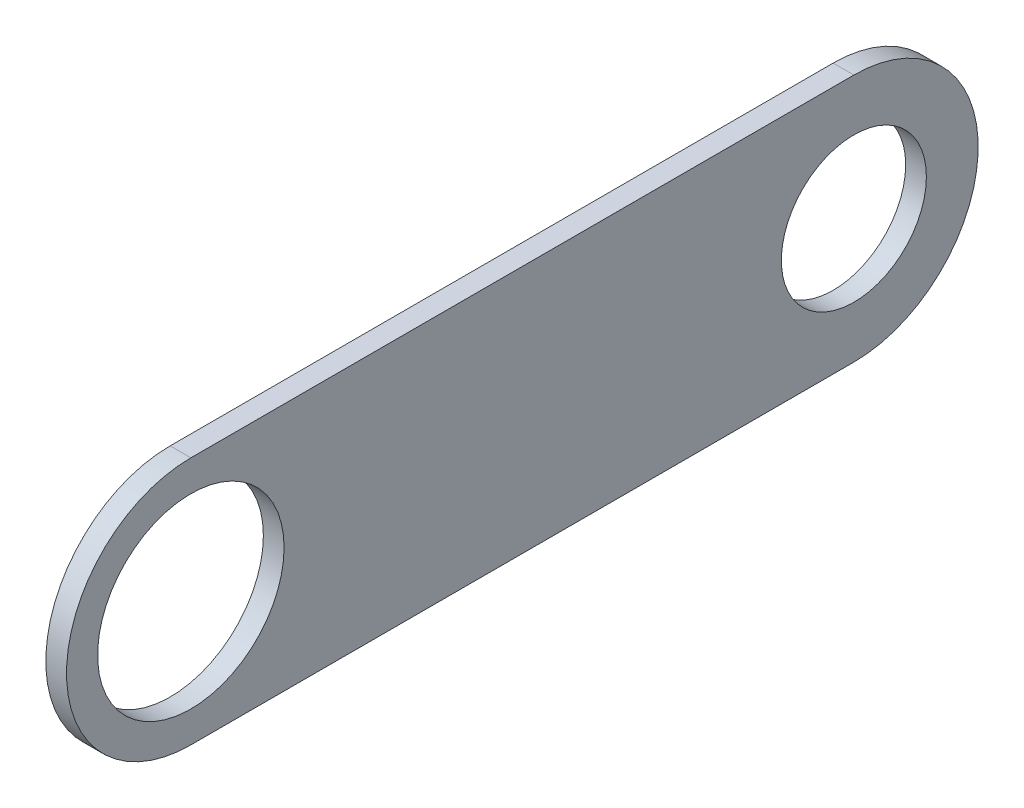
ISO-10303-21;
HEADER;
FILE_DESCRIPTION(('STEP AP214'),'2;1');
FILE_NAME('part.step','',(''),(''),'','','');
FILE_SCHEMA(('AUTOMOTIVE_DESIGN { 1 0 10303 214 1 1 1 1 }'));
ENDSEC;
DATA;
#1=APPLICATION_CONTEXT('core data for automotive mechanical design processes');
#2=APPLICATION_PROTOCOL_DEFINITION('international standard','automotive_design',2000,#1);
#3=PRODUCT_CONTEXT('',#1,'mechanical');
#4=PRODUCT('Part','Part','',(#3));
#5=PRODUCT_RELATED_PRODUCT_CATEGORY('part','',(#4));
#6=PRODUCT_DEFINITION_FORMATION('','',#4);
#7=PRODUCT_DEFINITION_CONTEXT('part definition',#1,'design');
#8=PRODUCT_DEFINITION('design','',#6,#7);
#9=PRODUCT_DEFINITION_SHAPE('','',#8);
#10=(LENGTH_UNIT() NAMED_UNIT(*) SI_UNIT(.MILLI.,.METRE.));
#11=(NAMED_UNIT(*) PLANE_ANGLE_UNIT() SI_UNIT($,.RADIAN.));
#12=(NAMED_UNIT(*) SI_UNIT($,.STERADIAN.) SOLID_ANGLE_UNIT());
#13=UNCERTAINTY_MEASURE_WITH_UNIT(LENGTH_MEASURE(1.E-05),#10,'distance_accuracy_value','');
#14=(GEOMETRIC_REPRESENTATION_CONTEXT(3) GLOBAL_UNCERTAINTY_ASSIGNED_CONTEXT((#13)) GLOBAL_UNIT_ASSIGNED_CONTEXT((#10,
#11,#12)) REPRESENTATION_CONTEXT('',''));
#15=CARTESIAN_POINT('',(0.,0.,0.));
#16=DIRECTION('',(0.,0.,1.));
#17=DIRECTION('',(1.,0.,0.));
#18=AXIS2_PLACEMENT_3D('',#15,#16,#17);
#19=CARTESIAN_POINT('',(3.175,0.,50.8));
#20=DIRECTION('',(1.,0.,0.));
#21=DIRECTION('',(0.,0.,-1.));
#22=AXIS2_PLACEMENT_3D('',#19,#20,#21);
#23=PLANE('',#22);
#24=CARTESIAN_POINT('',(3.175,0.,50.8));
#25=DIRECTION('',(1.,0.,0.));
#26=DIRECTION('',(0.,0.,-1.));
#27=AXIS2_PLACEMENT_3D('',#24,#25,#26);
#28=CIRCLE('',#27,14.2875);
#29=CARTESIAN_POINT('',(3.175,0.,36.5125));
#30=VERTEX_POINT('',#29);
#31=EDGE_CURVE('E106',#30,#30,#28,.T.);
#32=ORIENTED_EDGE('',*,*,#31,.F.);
#33=EDGE_LOOP('',(#32));
#34=FACE_BOUND('',#33,.T.);
#35=CARTESIAN_POINT('',(3.175,0.,50.8));
#36=DIRECTION('',(1.,0.,0.));
#37=DIRECTION('',(0.,0.,-1.));
#38=AXIS2_PLACEMENT_3D('',#35,#36,#37);
#39=CIRCLE('',#38,19.05);
#40=CARTESIAN_POINT('',(3.175,19.05,50.8));
#41=VERTEX_POINT('',#40);
#42=CARTESIAN_POINT('',(3.175,-19.05,50.8));
#43=VERTEX_POINT('',#42);
#44=EDGE_CURVE('E91',#41,#43,#39,.T.);
#45=ORIENTED_EDGE('',*,*,#44,.T.);
#46=DIRECTION('',(0.,0.,-1.));
#47=VECTOR('',#46,1.);
#48=CARTESIAN_POINT('',(3.175,-19.05,50.8));
#49=LINE('',#48,#47);
#50=CARTESIAN_POINT('',(3.175,-19.05,-50.8));
#51=VERTEX_POINT('',#50);
#52=EDGE_CURVE('E86',#43,#51,#49,.T.);
#53=ORIENTED_EDGE('',*,*,#52,.T.);
#54=CARTESIAN_POINT('',(3.175,0.,-50.8));
#55=DIRECTION('',(1.,0.,0.));
#56=DIRECTION('',(0.,0.,-1.));
#57=AXIS2_PLACEMENT_3D('',#54,#55,#56);
#58=CIRCLE('',#57,19.05);
#59=CARTESIAN_POINT('',(3.175,19.05,-50.8));
#60=VERTEX_POINT('',#59);
#61=EDGE_CURVE('E89',#51,#60,#58,.T.);
#62=ORIENTED_EDGE('',*,*,#61,.T.);
#63=DIRECTION('',(0.,0.,1.));
#64=VECTOR('',#63,1.);
#65=CARTESIAN_POINT('',(3.175,19.05,50.8));
#66=LINE('',#65,#64);
#67=EDGE_CURVE('E56',#60,#41,#66,.T.);
#68=ORIENTED_EDGE('',*,*,#67,.T.);
#69=EDGE_LOOP('',(#45,#53,#62,#68));
#70=FACE_BOUND('',#69,.T.);
#71=CARTESIAN_POINT('',(3.175,0.,-50.8));
#72=DIRECTION('',(1.,0.,0.));
#73=DIRECTION('',(0.,0.,-1.));
#74=AXIS2_PLACEMENT_3D('',#71,#72,#73);
#75=CIRCLE('',#74,11.1125);
#76=CARTESIAN_POINT('',(3.175,0.,-61.9125));
#77=VERTEX_POINT('',#76);
#78=EDGE_CURVE('E121',#77,#77,#75,.T.);
#79=ORIENTED_EDGE('',*,*,#78,.F.);
#80=EDGE_LOOP('',(#79));
#81=FACE_BOUND('',#80,.T.);
#82=ADVANCED_FACE('F39',(#34,#70,#81),#23,.T.);
#83=CARTESIAN_POINT('',(0.,0.,50.8));
#84=DIRECTION('',(1.,0.,0.));
#85=DIRECTION('',(0.,0.,-1.));
#86=AXIS2_PLACEMENT_3D('',#83,#84,#85);
#87=PLANE('',#86);
#88=CARTESIAN_POINT('',(0.,0.,50.8));
#89=DIRECTION('',(1.,0.,0.));
#90=DIRECTION('',(0.,0.,-1.));
#91=AXIS2_PLACEMENT_3D('',#88,#89,#90);
#92=CIRCLE('',#91,19.05);
#93=CARTESIAN_POINT('',(0.,19.05,50.8));
#94=VERTEX_POINT('',#93);
#95=CARTESIAN_POINT('',(0.,-19.05,50.8));
#96=VERTEX_POINT('',#95);
#97=EDGE_CURVE('E103',#94,#96,#92,.T.);
#98=ORIENTED_EDGE('',*,*,#97,.F.);
#99=DIRECTION('',(0.,0.,1.));
#100=VECTOR('',#99,1.);
#101=CARTESIAN_POINT('',(0.,19.05,50.8));
#102=LINE('',#101,#100);
#103=CARTESIAN_POINT('',(0.,19.05,-50.8));
#104=VERTEX_POINT('',#103);
#105=EDGE_CURVE('E79',#104,#94,#102,.T.);
#106=ORIENTED_EDGE('',*,*,#105,.F.);
#107=CARTESIAN_POINT('',(0.,0.,-50.8));
#108=DIRECTION('',(1.,0.,0.));
#109=DIRECTION('',(0.,0.,-1.));
#110=AXIS2_PLACEMENT_3D('',#107,#108,#109);
#111=CIRCLE('',#110,19.05);
#112=CARTESIAN_POINT('',(0.,-19.05,-50.8));
#113=VERTEX_POINT('',#112);
#114=EDGE_CURVE('E73',#113,#104,#111,.T.);
#115=ORIENTED_EDGE('',*,*,#114,.F.);
#116=DIRECTION('',(0.,0.,-1.));
#117=VECTOR('',#116,1.);
#118=CARTESIAN_POINT('',(0.,-19.05,50.8));
#119=LINE('',#118,#117);
#120=EDGE_CURVE('E95',#96,#113,#119,.T.);
#121=ORIENTED_EDGE('',*,*,#120,.F.);
#122=EDGE_LOOP('',(#98,#106,#115,#121));
#123=FACE_BOUND('',#122,.T.);
#124=CARTESIAN_POINT('',(0.,0.,50.8));
#125=DIRECTION('',(1.,0.,0.));
#126=DIRECTION('',(0.,0.,-1.));
#127=AXIS2_PLACEMENT_3D('',#124,#125,#126);
#128=CIRCLE('',#127,14.2875);
#129=CARTESIAN_POINT('',(0.,0.,36.5125));
#130=VERTEX_POINT('',#129);
#131=EDGE_CURVE('E118',#130,#130,#128,.T.);
#132=ORIENTED_EDGE('',*,*,#131,.T.);
#133=EDGE_LOOP('',(#132));
#134=FACE_BOUND('',#133,.T.);
#135=CARTESIAN_POINT('',(0.,0.,-50.8));
#136=DIRECTION('',(1.,0.,0.));
#137=DIRECTION('',(0.,0.,-1.));
#138=AXIS2_PLACEMENT_3D('',#135,#136,#137);
#139=CIRCLE('',#138,11.1125);
#140=CARTESIAN_POINT('',(0.,0.,-61.9125));
#141=VERTEX_POINT('',#140);
#142=EDGE_CURVE('E124',#141,#141,#139,.T.);
#143=ORIENTED_EDGE('',*,*,#142,.T.);
#144=EDGE_LOOP('',(#143));
#145=FACE_BOUND('',#144,.T.);
#146=ADVANCED_FACE('F114',(#123,#134,#145),#87,.F.);
#147=CARTESIAN_POINT('',(3.175,0.,50.8));
#148=DIRECTION('',(-1.,0.,0.));
#149=DIRECTION('',(0.,0.,1.));
#150=AXIS2_PLACEMENT_3D('',#147,#148,#149);
#151=CYLINDRICAL_SURFACE('',#150,19.05);
#152=ORIENTED_EDGE('',*,*,#97,.T.);
#153=DIRECTION('',(-1.,0.,0.));
#154=VECTOR('',#153,1.);
#155=CARTESIAN_POINT('',(3.175,-19.05,50.8));
#156=LINE('',#155,#154);
#157=EDGE_CURVE('E11',#43,#96,#156,.T.);
#158=ORIENTED_EDGE('',*,*,#157,.F.);
#159=ORIENTED_EDGE('',*,*,#44,.F.);
#160=DIRECTION('',(-1.,0.,0.));
#161=VECTOR('',#160,1.);
#162=CARTESIAN_POINT('',(3.175,19.05,50.8));
#163=LINE('',#162,#161);
#164=EDGE_CURVE('E99',#41,#94,#163,.T.);
#165=ORIENTED_EDGE('',*,*,#164,.T.);
#166=EDGE_LOOP('',(#152,#158,#159,#165));
#167=FACE_BOUND('',#166,.T.);
#168=ADVANCED_FACE('F41',(#167),#151,.T.);
#169=CARTESIAN_POINT('',(3.175,-19.05,50.8));
#170=DIRECTION('',(0.,1.,0.));
#171=DIRECTION('',(0.,0.,1.));
#172=AXIS2_PLACEMENT_3D('',#169,#170,#171);
#173=PLANE('',#172);
#174=ORIENTED_EDGE('',*,*,#120,.T.);
#175=DIRECTION('',(-1.,0.,0.));
#176=VECTOR('',#175,1.);
#177=CARTESIAN_POINT('',(3.175,-19.05,-50.8));
#178=LINE('',#177,#176);
#179=EDGE_CURVE('E48',#51,#113,#178,.T.);
#180=ORIENTED_EDGE('',*,*,#179,.F.);
#181=ORIENTED_EDGE('',*,*,#52,.F.);
#182=ORIENTED_EDGE('',*,*,#157,.T.);
#183=EDGE_LOOP('',(#174,#180,#181,#182));
#184=FACE_BOUND('',#183,.T.);
#185=ADVANCED_FACE('F94',(#184),#173,.F.);
#186=CARTESIAN_POINT('',(3.175,0.,-50.8));
#187=DIRECTION('',(-1.,0.,0.));
#188=DIRECTION('',(0.,0.,1.));
#189=AXIS2_PLACEMENT_3D('',#186,#187,#188);
#190=CYLINDRICAL_SURFACE('',#189,19.05);
#191=ORIENTED_EDGE('',*,*,#114,.T.);
#192=DIRECTION('',(-1.,0.,0.));
#193=VECTOR('',#192,1.);
#194=CARTESIAN_POINT('',(3.175,19.05,-50.8));
#195=LINE('',#194,#193);
#196=EDGE_CURVE('E96',#60,#104,#195,.T.);
#197=ORIENTED_EDGE('',*,*,#196,.F.);
#198=ORIENTED_EDGE('',*,*,#61,.F.);
#199=ORIENTED_EDGE('',*,*,#179,.T.);
#200=EDGE_LOOP('',(#191,#197,#198,#199));
#201=FACE_BOUND('',#200,.T.);
#202=ADVANCED_FACE('F97',(#201),#190,.T.);
#203=CARTESIAN_POINT('',(3.175,19.05,50.8));
#204=DIRECTION('',(0.,-1.,0.));
#205=DIRECTION('',(0.,0.,-1.));
#206=AXIS2_PLACEMENT_3D('',#203,#204,#205);
#207=PLANE('',#206);
#208=ORIENTED_EDGE('',*,*,#105,.T.);
#209=ORIENTED_EDGE('',*,*,#164,.F.);
#210=ORIENTED_EDGE('',*,*,#67,.F.);
#211=ORIENTED_EDGE('',*,*,#196,.T.);
#212=EDGE_LOOP('',(#208,#209,#210,#211));
#213=FACE_BOUND('',#212,.T.);
#214=ADVANCED_FACE('F111',(#213),#207,.F.);
#215=CARTESIAN_POINT('',(3.175,0.,50.8));
#216=DIRECTION('',(-1.,0.,0.));
#217=DIRECTION('',(0.,0.,1.));
#218=AXIS2_PLACEMENT_3D('',#215,#216,#217);
#219=CYLINDRICAL_SURFACE('',#218,14.2875);
#220=ORIENTED_EDGE('',*,*,#31,.T.);
#221=EDGE_LOOP('',(#220));
#222=FACE_BOUND('',#221,.T.);
#223=ORIENTED_EDGE('',*,*,#131,.F.);
#224=EDGE_LOOP('',(#223));
#225=FACE_BOUND('',#224,.T.);
#226=ADVANCED_FACE('F141',(#222,#225),#219,.F.);
#227=CARTESIAN_POINT('',(3.175,0.,-50.8));
#228=DIRECTION('',(-1.,0.,0.));
#229=DIRECTION('',(0.,0.,1.));
#230=AXIS2_PLACEMENT_3D('',#227,#228,#229);
#231=CYLINDRICAL_SURFACE('',#230,11.1125);
#232=ORIENTED_EDGE('',*,*,#78,.T.);
#233=EDGE_LOOP('',(#232));
#234=FACE_BOUND('',#233,.T.);
#235=ORIENTED_EDGE('',*,*,#142,.F.);
#236=EDGE_LOOP('',(#235));
#237=FACE_BOUND('',#236,.T.);
#238=ADVANCED_FACE('F130',(#234,#237),#231,.F.);
#239=CLOSED_SHELL('',(#82,#146,#168,#185,#202,#214,#226,#238));
#240=MANIFOLD_SOLID_BREP('B2',#239);
#241=ADVANCED_BREP_SHAPE_REPRESENTATION('',(#18,#240),#14);
#242=SHAPE_DEFINITION_REPRESENTATION(#9,#241);
ENDSEC;
END-ISO-10303-21;
